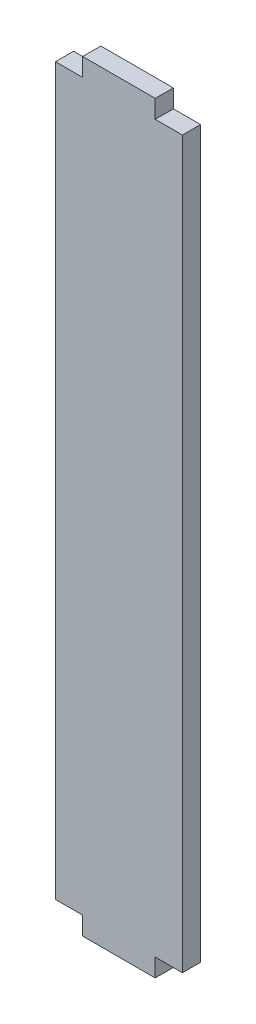
ISO-10303-21;
HEADER;
FILE_DESCRIPTION(('STEP AP214'),'2;1');
FILE_NAME('part.step','',(''),(''),'','','');
FILE_SCHEMA(('AUTOMOTIVE_DESIGN { 1 0 10303 214 1 1 1 1 }'));
ENDSEC;
DATA;
#1=APPLICATION_CONTEXT('core data for automotive mechanical design processes');
#2=APPLICATION_PROTOCOL_DEFINITION('international standard','automotive_design',2000,#1);
#3=PRODUCT_CONTEXT('',#1,'mechanical');
#4=PRODUCT('Part','Part','',(#3));
#5=PRODUCT_RELATED_PRODUCT_CATEGORY('part','',(#4));
#6=PRODUCT_DEFINITION_FORMATION('','',#4);
#7=PRODUCT_DEFINITION_CONTEXT('part definition',#1,'design');
#8=PRODUCT_DEFINITION('design','',#6,#7);
#9=PRODUCT_DEFINITION_SHAPE('','',#8);
#10=(LENGTH_UNIT() NAMED_UNIT(*) SI_UNIT(.MILLI.,.METRE.));
#11=(NAMED_UNIT(*) PLANE_ANGLE_UNIT() SI_UNIT($,.RADIAN.));
#12=(NAMED_UNIT(*) SI_UNIT($,.STERADIAN.) SOLID_ANGLE_UNIT());
#13=UNCERTAINTY_MEASURE_WITH_UNIT(LENGTH_MEASURE(1.E-05),#10,'distance_accuracy_value','');
#14=(GEOMETRIC_REPRESENTATION_CONTEXT(3) GLOBAL_UNCERTAINTY_ASSIGNED_CONTEXT((#13)) GLOBAL_UNIT_ASSIGNED_CONTEXT((#10,
#11,#12)) REPRESENTATION_CONTEXT('',''));
#15=CARTESIAN_POINT('',(0.,0.,0.));
#16=DIRECTION('',(0.,0.,1.));
#17=DIRECTION('',(1.,0.,0.));
#18=AXIS2_PLACEMENT_3D('',#15,#16,#17);
#19=CARTESIAN_POINT('',(0.,0.,5.));
#20=DIRECTION('',(0.,-1.,0.));
#21=DIRECTION('',(1.,0.,0.));
#22=AXIS2_PLACEMENT_3D('',#19,#20,#21);
#23=PLANE('',#22);
#24=DIRECTION('',(-1.,0.,0.));
#25=VECTOR('',#24,1.);
#26=CARTESIAN_POINT('',(0.,0.,0.));
#27=LINE('',#26,#25);
#28=CARTESIAN_POINT('',(0.,0.,0.));
#29=VERTEX_POINT('',#28);
#30=CARTESIAN_POINT('',(-7.5,0.,0.));
#31=VERTEX_POINT('',#30);
#32=EDGE_CURVE('E209',#29,#31,#27,.T.);
#33=ORIENTED_EDGE('',*,*,#32,.T.);
#34=DIRECTION('',(0.,0.,-1.));
#35=VECTOR('',#34,1.);
#36=CARTESIAN_POINT('',(-7.5,0.,5.));
#37=LINE('',#36,#35);
#38=CARTESIAN_POINT('',(-7.5,0.,5.));
#39=VERTEX_POINT('',#38);
#40=EDGE_CURVE('E11',#39,#31,#37,.T.);
#41=ORIENTED_EDGE('',*,*,#40,.F.);
#42=DIRECTION('',(-1.,0.,0.));
#43=VECTOR('',#42,1.);
#44=CARTESIAN_POINT('',(0.,0.,5.));
#45=LINE('',#44,#43);
#46=CARTESIAN_POINT('',(0.,0.,5.));
#47=VERTEX_POINT('',#46);
#48=EDGE_CURVE('E166',#47,#39,#45,.T.);
#49=ORIENTED_EDGE('',*,*,#48,.F.);
#50=DIRECTION('',(0.,0.,-1.));
#51=VECTOR('',#50,1.);
#52=CARTESIAN_POINT('',(0.,0.,5.));
#53=LINE('',#52,#51);
#54=EDGE_CURVE('E51',#47,#29,#53,.T.);
#55=ORIENTED_EDGE('',*,*,#54,.T.);
#56=EDGE_LOOP('',(#33,#41,#49,#55));
#57=FACE_BOUND('',#56,.T.);
#58=ADVANCED_FACE('F34',(#57),#23,.F.);
#59=CARTESIAN_POINT('',(-7.5,0.,5.));
#60=DIRECTION('',(-1.,0.,0.));
#61=DIRECTION('',(0.,0.,1.));
#62=AXIS2_PLACEMENT_3D('',#59,#60,#61);
#63=PLANE('',#62);
#64=DIRECTION('',(0.,1.,0.));
#65=VECTOR('',#64,1.);
#66=CARTESIAN_POINT('',(-7.5,0.,0.));
#67=LINE('',#66,#65);
#68=CARTESIAN_POINT('',(-7.5,5.,0.));
#69=VERTEX_POINT('',#68);
#70=EDGE_CURVE('E208',#31,#69,#67,.T.);
#71=ORIENTED_EDGE('',*,*,#70,.T.);
#72=DIRECTION('',(0.,0.,-1.));
#73=VECTOR('',#72,1.);
#74=CARTESIAN_POINT('',(-7.5,5.,5.));
#75=LINE('',#74,#73);
#76=CARTESIAN_POINT('',(-7.5,5.,5.));
#77=VERTEX_POINT('',#76);
#78=EDGE_CURVE('E43',#77,#69,#75,.T.);
#79=ORIENTED_EDGE('',*,*,#78,.F.);
#80=DIRECTION('',(0.,1.,0.));
#81=VECTOR('',#80,1.);
#82=CARTESIAN_POINT('',(-7.5,0.,5.));
#83=LINE('',#82,#81);
#84=EDGE_CURVE('E101',#39,#77,#83,.T.);
#85=ORIENTED_EDGE('',*,*,#84,.F.);
#86=ORIENTED_EDGE('',*,*,#40,.T.);
#87=EDGE_LOOP('',(#71,#79,#85,#86));
#88=FACE_BOUND('',#87,.T.);
#89=ADVANCED_FACE('F36',(#88),#63,.F.);
#90=CARTESIAN_POINT('',(0.,5.,5.));
#91=DIRECTION('',(0.,1.,0.));
#92=DIRECTION('',(0.,0.,1.));
#93=AXIS2_PLACEMENT_3D('',#90,#91,#92);
#94=PLANE('',#93);
#95=DIRECTION('',(1.,0.,0.));
#96=VECTOR('',#95,1.);
#97=CARTESIAN_POINT('',(0.,5.,0.));
#98=LINE('',#97,#96);
#99=CARTESIAN_POINT('',(-27.5,5.,0.));
#100=VERTEX_POINT('',#99);
#101=EDGE_CURVE('E205',#100,#69,#98,.T.);
#102=ORIENTED_EDGE('',*,*,#101,.F.);
#103=DIRECTION('',(0.,0.,-1.));
#104=VECTOR('',#103,1.);
#105=CARTESIAN_POINT('',(-27.5,5.,5.));
#106=LINE('',#105,#104);
#107=CARTESIAN_POINT('',(-27.5,5.,5.));
#108=VERTEX_POINT('',#107);
#109=EDGE_CURVE('E199',#108,#100,#106,.T.);
#110=ORIENTED_EDGE('',*,*,#109,.F.);
#111=DIRECTION('',(1.,0.,0.));
#112=VECTOR('',#111,1.);
#113=CARTESIAN_POINT('',(0.,5.,5.));
#114=LINE('',#113,#112);
#115=EDGE_CURVE('E170',#108,#77,#114,.T.);
#116=ORIENTED_EDGE('',*,*,#115,.T.);
#117=ORIENTED_EDGE('',*,*,#78,.T.);
#118=EDGE_LOOP('',(#102,#110,#116,#117));
#119=FACE_BOUND('',#118,.T.);
#120=ADVANCED_FACE('F203',(#119),#94,.T.);
#121=CARTESIAN_POINT('',(-27.5,0.,5.));
#122=DIRECTION('',(-1.,0.,0.));
#123=DIRECTION('',(0.,0.,1.));
#124=AXIS2_PLACEMENT_3D('',#121,#122,#123);
#125=PLANE('',#124);
#126=DIRECTION('',(0.,1.,0.));
#127=VECTOR('',#126,1.);
#128=CARTESIAN_POINT('',(-27.5,0.,0.));
#129=LINE('',#128,#127);
#130=CARTESIAN_POINT('',(-27.5,0.,0.));
#131=VERTEX_POINT('',#130);
#132=EDGE_CURVE('E214',#131,#100,#129,.T.);
#133=ORIENTED_EDGE('',*,*,#132,.F.);
#134=DIRECTION('',(0.,0.,-1.));
#135=VECTOR('',#134,1.);
#136=CARTESIAN_POINT('',(-27.5,0.,5.));
#137=LINE('',#136,#135);
#138=CARTESIAN_POINT('',(-27.5,0.,5.));
#139=VERTEX_POINT('',#138);
#140=EDGE_CURVE('E197',#139,#131,#137,.T.);
#141=ORIENTED_EDGE('',*,*,#140,.F.);
#142=DIRECTION('',(0.,1.,0.));
#143=VECTOR('',#142,1.);
#144=CARTESIAN_POINT('',(-27.5,0.,5.));
#145=LINE('',#144,#143);
#146=EDGE_CURVE('E164',#139,#108,#145,.T.);
#147=ORIENTED_EDGE('',*,*,#146,.T.);
#148=ORIENTED_EDGE('',*,*,#109,.T.);
#149=EDGE_LOOP('',(#133,#141,#147,#148));
#150=FACE_BOUND('',#149,.T.);
#151=ADVANCED_FACE('F241',(#150),#125,.T.);
#152=CARTESIAN_POINT('',(-35.,0.,0.));
#153=VERTEX_POINT('',#152);
#154=EDGE_CURVE('E216',#131,#153,#27,.T.);
#155=ORIENTED_EDGE('',*,*,#154,.T.);
#156=DIRECTION('',(0.,0.,-1.));
#157=VECTOR('',#156,1.);
#158=CARTESIAN_POINT('',(-35.,0.,5.));
#159=LINE('',#158,#157);
#160=CARTESIAN_POINT('',(-35.,0.,5.));
#161=VERTEX_POINT('',#160);
#162=EDGE_CURVE('E194',#161,#153,#159,.T.);
#163=ORIENTED_EDGE('',*,*,#162,.F.);
#164=EDGE_CURVE('E161',#139,#161,#45,.T.);
#165=ORIENTED_EDGE('',*,*,#164,.F.);
#166=ORIENTED_EDGE('',*,*,#140,.T.);
#167=EDGE_LOOP('',(#155,#163,#165,#166));
#168=FACE_BOUND('',#167,.T.);
#169=ADVANCED_FACE('F244',(#168),#23,.F.);
#170=CARTESIAN_POINT('',(-35.,0.,5.));
#171=DIRECTION('',(1.,0.,0.));
#172=DIRECTION('',(0.,1.,0.));
#173=AXIS2_PLACEMENT_3D('',#170,#171,#172);
#174=PLANE('',#173);
#175=DIRECTION('',(0.,-1.,0.));
#176=VECTOR('',#175,1.);
#177=CARTESIAN_POINT('',(-35.,0.,0.));
#178=LINE('',#177,#176);
#179=CARTESIAN_POINT('',(-35.,-200.,0.));
#180=VERTEX_POINT('',#179);
#181=EDGE_CURVE('E220',#153,#180,#178,.T.);
#182=ORIENTED_EDGE('',*,*,#181,.T.);
#183=DIRECTION('',(0.,0.,-1.));
#184=VECTOR('',#183,1.);
#185=CARTESIAN_POINT('',(-35.,-200.,5.));
#186=LINE('',#185,#184);
#187=CARTESIAN_POINT('',(-35.,-200.,5.));
#188=VERTEX_POINT('',#187);
#189=EDGE_CURVE('E192',#188,#180,#186,.T.);
#190=ORIENTED_EDGE('',*,*,#189,.F.);
#191=DIRECTION('',(0.,-1.,0.));
#192=VECTOR('',#191,1.);
#193=CARTESIAN_POINT('',(-35.,0.,5.));
#194=LINE('',#193,#192);
#195=EDGE_CURVE('E158',#161,#188,#194,.T.);
#196=ORIENTED_EDGE('',*,*,#195,.F.);
#197=ORIENTED_EDGE('',*,*,#162,.T.);
#198=EDGE_LOOP('',(#182,#190,#196,#197));
#199=FACE_BOUND('',#198,.T.);
#200=ADVANCED_FACE('F237',(#199),#174,.F.);
#201=CARTESIAN_POINT('',(0.,-200.,5.));
#202=DIRECTION('',(0.,-1.,0.));
#203=DIRECTION('',(0.,0.,-1.));
#204=AXIS2_PLACEMENT_3D('',#201,#202,#203);
#205=PLANE('',#204);
#206=DIRECTION('',(-1.,0.,0.));
#207=VECTOR('',#206,1.);
#208=CARTESIAN_POINT('',(0.,-200.,0.));
#209=LINE('',#208,#207);
#210=CARTESIAN_POINT('',(-27.5,-200.,0.));
#211=VERTEX_POINT('',#210);
#212=EDGE_CURVE('E180',#211,#180,#209,.T.);
#213=ORIENTED_EDGE('',*,*,#212,.F.);
#214=DIRECTION('',(0.,0.,-1.));
#215=VECTOR('',#214,1.);
#216=CARTESIAN_POINT('',(-27.5,-200.,5.));
#217=LINE('',#216,#215);
#218=CARTESIAN_POINT('',(-27.5,-200.,5.));
#219=VERTEX_POINT('',#218);
#220=EDGE_CURVE('E190',#219,#211,#217,.T.);
#221=ORIENTED_EDGE('',*,*,#220,.F.);
#222=DIRECTION('',(-1.,0.,0.));
#223=VECTOR('',#222,1.);
#224=CARTESIAN_POINT('',(0.,-200.,5.));
#225=LINE('',#224,#223);
#226=EDGE_CURVE('E152',#219,#188,#225,.T.);
#227=ORIENTED_EDGE('',*,*,#226,.T.);
#228=ORIENTED_EDGE('',*,*,#189,.T.);
#229=EDGE_LOOP('',(#213,#221,#227,#228));
#230=FACE_BOUND('',#229,.T.);
#231=ADVANCED_FACE('F234',(#230),#205,.T.);
#232=CARTESIAN_POINT('',(-27.5,0.,5.));
#233=DIRECTION('',(1.,0.,0.));
#234=DIRECTION('',(0.,0.,-1.));
#235=AXIS2_PLACEMENT_3D('',#232,#233,#234);
#236=PLANE('',#235);
#237=DIRECTION('',(0.,-1.,0.));
#238=VECTOR('',#237,1.);
#239=CARTESIAN_POINT('',(-27.5,0.,0.));
#240=LINE('',#239,#238);
#241=CARTESIAN_POINT('',(-27.5,-205.,0.));
#242=VERTEX_POINT('',#241);
#243=EDGE_CURVE('E224',#211,#242,#240,.T.);
#244=ORIENTED_EDGE('',*,*,#243,.T.);
#245=DIRECTION('',(0.,0.,-1.));
#246=VECTOR('',#245,1.);
#247=CARTESIAN_POINT('',(-27.5,-205.,5.));
#248=LINE('',#247,#246);
#249=CARTESIAN_POINT('',(-27.5,-205.,5.));
#250=VERTEX_POINT('',#249);
#251=EDGE_CURVE('E187',#250,#242,#248,.T.);
#252=ORIENTED_EDGE('',*,*,#251,.F.);
#253=DIRECTION('',(0.,-1.,0.));
#254=VECTOR('',#253,1.);
#255=CARTESIAN_POINT('',(-27.5,0.,5.));
#256=LINE('',#255,#254);
#257=EDGE_CURVE('E157',#219,#250,#256,.T.);
#258=ORIENTED_EDGE('',*,*,#257,.F.);
#259=ORIENTED_EDGE('',*,*,#220,.T.);
#260=EDGE_LOOP('',(#244,#252,#258,#259));
#261=FACE_BOUND('',#260,.T.);
#262=ADVANCED_FACE('F274',(#261),#236,.F.);
#263=CARTESIAN_POINT('',(0.,-205.,5.));
#264=DIRECTION('',(0.,1.,0.));
#265=DIRECTION('',(0.,0.,1.));
#266=AXIS2_PLACEMENT_3D('',#263,#264,#265);
#267=PLANE('',#266);
#268=DIRECTION('',(1.,0.,0.));
#269=VECTOR('',#268,1.);
#270=CARTESIAN_POINT('',(0.,-205.,0.));
#271=LINE('',#270,#269);
#272=CARTESIAN_POINT('',(-7.5,-205.,0.));
#273=VERTEX_POINT('',#272);
#274=EDGE_CURVE('E225',#242,#273,#271,.T.);
#275=ORIENTED_EDGE('',*,*,#274,.T.);
#276=DIRECTION('',(0.,0.,-1.));
#277=VECTOR('',#276,1.);
#278=CARTESIAN_POINT('',(-7.5,-205.,5.));
#279=LINE('',#278,#277);
#280=CARTESIAN_POINT('',(-7.5,-205.,5.));
#281=VERTEX_POINT('',#280);
#282=EDGE_CURVE('E138',#281,#273,#279,.T.);
#283=ORIENTED_EDGE('',*,*,#282,.F.);
#284=DIRECTION('',(1.,0.,0.));
#285=VECTOR('',#284,1.);
#286=CARTESIAN_POINT('',(0.,-205.,5.));
#287=LINE('',#286,#285);
#288=EDGE_CURVE('E146',#250,#281,#287,.T.);
#289=ORIENTED_EDGE('',*,*,#288,.F.);
#290=ORIENTED_EDGE('',*,*,#251,.T.);
#291=EDGE_LOOP('',(#275,#283,#289,#290));
#292=FACE_BOUND('',#291,.T.);
#293=ADVANCED_FACE('F271',(#292),#267,.F.);
#294=CARTESIAN_POINT('',(-7.5,0.,5.));
#295=DIRECTION('',(1.,0.,0.));
#296=DIRECTION('',(0.,0.,-1.));
#297=AXIS2_PLACEMENT_3D('',#294,#295,#296);
#298=PLANE('',#297);
#299=DIRECTION('',(0.,-1.,0.));
#300=VECTOR('',#299,1.);
#301=CARTESIAN_POINT('',(-7.5,0.,0.));
#302=LINE('',#301,#300);
#303=CARTESIAN_POINT('',(-7.5,-200.,0.));
#304=VERTEX_POINT('',#303);
#305=EDGE_CURVE('E134',#304,#273,#302,.T.);
#306=ORIENTED_EDGE('',*,*,#305,.F.);
#307=DIRECTION('',(0.,0.,-1.));
#308=VECTOR('',#307,1.);
#309=CARTESIAN_POINT('',(-7.5,-200.,5.));
#310=LINE('',#309,#308);
#311=CARTESIAN_POINT('',(-7.5,-200.,5.));
#312=VERTEX_POINT('',#311);
#313=EDGE_CURVE('E129',#312,#304,#310,.T.);
#314=ORIENTED_EDGE('',*,*,#313,.F.);
#315=DIRECTION('',(0.,-1.,0.));
#316=VECTOR('',#315,1.);
#317=CARTESIAN_POINT('',(-7.5,0.,5.));
#318=LINE('',#317,#316);
#319=EDGE_CURVE('E132',#312,#281,#318,.T.);
#320=ORIENTED_EDGE('',*,*,#319,.T.);
#321=ORIENTED_EDGE('',*,*,#282,.T.);
#322=EDGE_LOOP('',(#306,#314,#320,#321));
#323=FACE_BOUND('',#322,.T.);
#324=ADVANCED_FACE('F131',(#323),#298,.T.);
#325=CARTESIAN_POINT('',(0.,-200.,0.));
#326=VERTEX_POINT('',#325);
#327=EDGE_CURVE('E176',#326,#304,#209,.T.);
#328=ORIENTED_EDGE('',*,*,#327,.F.);
#329=DIRECTION('',(0.,0.,-1.));
#330=VECTOR('',#329,1.);
#331=CARTESIAN_POINT('',(0.,-200.,5.));
#332=LINE('',#331,#330);
#333=CARTESIAN_POINT('',(0.,-200.,5.));
#334=VERTEX_POINT('',#333);
#335=EDGE_CURVE('E89',#334,#326,#332,.T.);
#336=ORIENTED_EDGE('',*,*,#335,.F.);
#337=EDGE_CURVE('E144',#334,#312,#225,.T.);
#338=ORIENTED_EDGE('',*,*,#337,.T.);
#339=ORIENTED_EDGE('',*,*,#313,.T.);
#340=EDGE_LOOP('',(#328,#336,#338,#339));
#341=FACE_BOUND('',#340,.T.);
#342=ADVANCED_FACE('F149',(#341),#205,.T.);
#343=CARTESIAN_POINT('',(0.,0.,5.));
#344=DIRECTION('',(1.,0.,0.));
#345=DIRECTION('',(0.,0.,-1.));
#346=AXIS2_PLACEMENT_3D('',#343,#344,#345);
#347=PLANE('',#346);
#348=DIRECTION('',(0.,-1.,0.));
#349=VECTOR('',#348,1.);
#350=CARTESIAN_POINT('',(0.,0.,0.));
#351=LINE('',#350,#349);
#352=EDGE_CURVE('E173',#29,#326,#351,.T.);
#353=ORIENTED_EDGE('',*,*,#352,.F.);
#354=ORIENTED_EDGE('',*,*,#54,.F.);
#355=DIRECTION('',(0.,-1.,0.));
#356=VECTOR('',#355,1.);
#357=CARTESIAN_POINT('',(0.,0.,5.));
#358=LINE('',#357,#356);
#359=EDGE_CURVE('E150',#47,#334,#358,.T.);
#360=ORIENTED_EDGE('',*,*,#359,.T.);
#361=ORIENTED_EDGE('',*,*,#335,.T.);
#362=EDGE_LOOP('',(#353,#354,#360,#361));
#363=FACE_BOUND('',#362,.T.);
#364=ADVANCED_FACE('F258',(#363),#347,.T.);
#365=CARTESIAN_POINT('',(0.,0.,5.));
#366=DIRECTION('',(0.,0.,1.));
#367=DIRECTION('',(1.,0.,0.));
#368=AXIS2_PLACEMENT_3D('',#365,#366,#367);
#369=PLANE('',#368);
#370=ORIENTED_EDGE('',*,*,#48,.T.);
#371=ORIENTED_EDGE('',*,*,#84,.T.);
#372=ORIENTED_EDGE('',*,*,#115,.F.);
#373=ORIENTED_EDGE('',*,*,#146,.F.);
#374=ORIENTED_EDGE('',*,*,#164,.T.);
#375=ORIENTED_EDGE('',*,*,#195,.T.);
#376=ORIENTED_EDGE('',*,*,#226,.F.);
#377=ORIENTED_EDGE('',*,*,#257,.T.);
#378=ORIENTED_EDGE('',*,*,#288,.T.);
#379=ORIENTED_EDGE('',*,*,#319,.F.);
#380=ORIENTED_EDGE('',*,*,#337,.F.);
#381=ORIENTED_EDGE('',*,*,#359,.F.);
#382=EDGE_LOOP('',(#370,#371,#372,#373,#374,#375,#376,#377,#378,#379,#380,#381));
#383=FACE_BOUND('',#382,.T.);
#384=ADVANCED_FACE('F142',(#383),#369,.T.);
#385=CARTESIAN_POINT('',(0.,0.,0.));
#386=DIRECTION('',(0.,0.,1.));
#387=DIRECTION('',(1.,0.,0.));
#388=AXIS2_PLACEMENT_3D('',#385,#386,#387);
#389=PLANE('',#388);
#390=ORIENTED_EDGE('',*,*,#32,.F.);
#391=ORIENTED_EDGE('',*,*,#352,.T.);
#392=ORIENTED_EDGE('',*,*,#327,.T.);
#393=ORIENTED_EDGE('',*,*,#305,.T.);
#394=ORIENTED_EDGE('',*,*,#274,.F.);
#395=ORIENTED_EDGE('',*,*,#243,.F.);
#396=ORIENTED_EDGE('',*,*,#212,.T.);
#397=ORIENTED_EDGE('',*,*,#181,.F.);
#398=ORIENTED_EDGE('',*,*,#154,.F.);
#399=ORIENTED_EDGE('',*,*,#132,.T.);
#400=ORIENTED_EDGE('',*,*,#101,.T.);
#401=ORIENTED_EDGE('',*,*,#70,.F.);
#402=EDGE_LOOP('',(#390,#391,#392,#393,#394,#395,#396,#397,#398,#399,#400,#401));
#403=FACE_BOUND('',#402,.T.);
#404=ADVANCED_FACE('F211',(#403),#389,.F.);
#405=CLOSED_SHELL('',(#58,#89,#120,#151,#169,#200,#231,#262,#293,#324,#342,#364,#384,#404));
#406=MANIFOLD_SOLID_BREP('B2',#405);
#407=ADVANCED_BREP_SHAPE_REPRESENTATION('',(#18,#406),#14);
#408=SHAPE_DEFINITION_REPRESENTATION(#9,#407);
ENDSEC;
END-ISO-10303-21;
